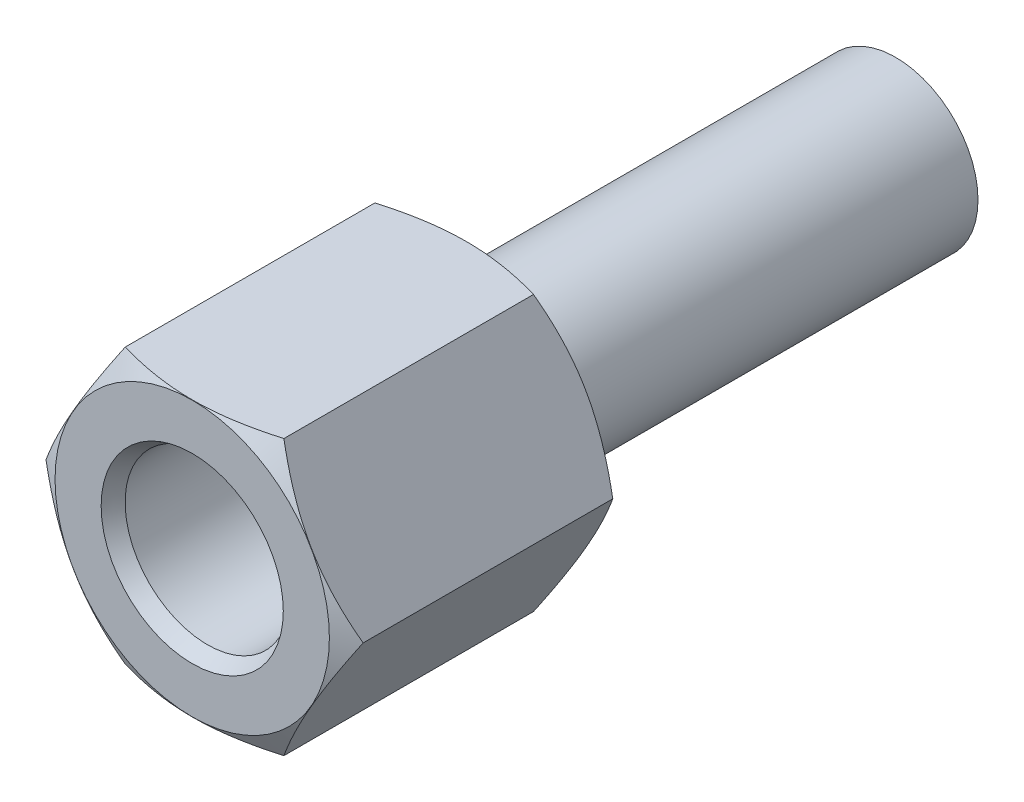
ISO-10303-21;
HEADER;
FILE_DESCRIPTION(('STEP AP214'),'2;1');
FILE_NAME('part.step','',(''),(''),'','','');
FILE_SCHEMA(('AUTOMOTIVE_DESIGN { 1 0 10303 214 1 1 1 1 }'));
ENDSEC;
DATA;
#1=APPLICATION_CONTEXT('core data for automotive mechanical design processes');
#2=APPLICATION_PROTOCOL_DEFINITION('international standard','automotive_design',2000,#1);
#3=PRODUCT_CONTEXT('',#1,'mechanical');
#4=PRODUCT('Part','Part','',(#3));
#5=PRODUCT_RELATED_PRODUCT_CATEGORY('part','',(#4));
#6=PRODUCT_DEFINITION_FORMATION('','',#4);
#7=PRODUCT_DEFINITION_CONTEXT('part definition',#1,'design');
#8=PRODUCT_DEFINITION('design','',#6,#7);
#9=PRODUCT_DEFINITION_SHAPE('','',#8);
#10=(LENGTH_UNIT() NAMED_UNIT(*) SI_UNIT(.MILLI.,.METRE.));
#11=(NAMED_UNIT(*) PLANE_ANGLE_UNIT() SI_UNIT($,.RADIAN.));
#12=(NAMED_UNIT(*) SI_UNIT($,.STERADIAN.) SOLID_ANGLE_UNIT());
#13=UNCERTAINTY_MEASURE_WITH_UNIT(LENGTH_MEASURE(1.E-05),#10,'distance_accuracy_value','');
#14=(GEOMETRIC_REPRESENTATION_CONTEXT(3) GLOBAL_UNCERTAINTY_ASSIGNED_CONTEXT((#13)) GLOBAL_UNIT_ASSIGNED_CONTEXT((#10,
#11,#12)) REPRESENTATION_CONTEXT('',''));
#15=CARTESIAN_POINT('',(0.,0.,0.));
#16=DIRECTION('',(0.,0.,1.));
#17=DIRECTION('',(1.,0.,0.));
#18=AXIS2_PLACEMENT_3D('',#15,#16,#17);
#19=CARTESIAN_POINT('',(0.,0.,2.00000000000955));
#20=DIRECTION('',(0.,0.,1.));
#21=DIRECTION('',(1.,0.,0.));
#22=AXIS2_PLACEMENT_3D('',#19,#20,#21);
#23=CONICAL_SURFACE('',#22,1.50000000002137,1.04719755119044);
#24=CARTESIAN_POINT('',(0.,0.,2.));
#25=DIRECTION('',(0.,0.,-1.));
#26=DIRECTION('',(-1.,0.,0.));
#27=AXIS2_PLACEMENT_3D('',#24,#25,#26);
#28=CIRCLE('',#27,1.5);
#29=CARTESIAN_POINT('',(-1.5,0.,2.));
#30=VERTEX_POINT('',#29);
#31=EDGE_CURVE('E229',#30,#30,#28,.F.);
#32=ORIENTED_EDGE('',*,*,#31,.T.);
#33=EDGE_LOOP('',(#32));
#34=FACE_BOUND('',#33,.T.);
#35=CARTESIAN_POINT('',(0.,0.,1.13397459620046));
#36=VERTEX_POINT('',#35);
#37=VERTEX_LOOP('',#36);
#38=FACE_BOUND('',#37,.T.);
#39=ADVANCED_FACE('F16',(#34,#38),#23,.F.);
#40=CARTESIAN_POINT('',(0.,0.,4.722871870789));
#41=DIRECTION('',(0.,0.,-1.));
#42=DIRECTION('',(-1.,0.,0.));
#43=AXIS2_PLACEMENT_3D('',#40,#41,#42);
#44=CYLINDRICAL_SURFACE('',#43,1.5);
#45=ORIENTED_EDGE('',*,*,#31,.F.);
#46=EDGE_LOOP('',(#45));
#47=FACE_BOUND('',#46,.T.);
#48=CARTESIAN_POINT('',(0.,0.,4.72287187079701));
#49=DIRECTION('',(0.,0.,1.));
#50=DIRECTION('',(1.,0.,0.));
#51=AXIS2_PLACEMENT_3D('',#48,#49,#50);
#52=CIRCLE('',#51,1.49999999996453);
#53=CARTESIAN_POINT('',(1.49999999996453,0.,4.72287187079701));
#54=VERTEX_POINT('',#53);
#55=EDGE_CURVE('E231',#54,#54,#52,.T.);
#56=ORIENTED_EDGE('',*,*,#55,.T.);
#57=EDGE_LOOP('',(#56));
#58=FACE_BOUND('',#57,.T.);
#59=ADVANCED_FACE('F74',(#47,#58),#44,.F.);
#60=CARTESIAN_POINT('',(0.,0.,4.99999999999545));
#61=DIRECTION('',(0.,0.,1.));
#62=DIRECTION('',(1.,0.,0.));
#63=AXIS2_PLACEMENT_3D('',#60,#61,#62);
#64=CONICAL_SURFACE('',#63,1.65999999995847,0.523598775601555);
#65=ORIENTED_EDGE('',*,*,#55,.F.);
#66=EDGE_LOOP('',(#65));
#67=FACE_BOUND('',#66,.T.);
#68=CARTESIAN_POINT('',(0.,0.,4.99999999999545));
#69=DIRECTION('',(0.,0.,1.));
#70=DIRECTION('',(1.,0.,0.));
#71=AXIS2_PLACEMENT_3D('',#68,#69,#70);
#72=CIRCLE('',#71,1.65999999995847);
#73=CARTESIAN_POINT('',(1.65999999995847,0.,4.99999999999545));
#74=VERTEX_POINT('',#73);
#75=EDGE_CURVE('E19',#74,#74,#72,.F.);
#76=ORIENTED_EDGE('',*,*,#75,.F.);
#77=EDGE_LOOP('',(#76));
#78=FACE_BOUND('',#77,.T.);
#79=ADVANCED_FACE('F80',(#67,#78),#64,.F.);
#80=CARTESIAN_POINT('',(0.,0.,5.));
#81=DIRECTION('',(0.,0.,1.));
#82=DIRECTION('',(1.,0.,0.));
#83=AXIS2_PLACEMENT_3D('',#80,#81,#82);
#84=PLANE('',#83);
#85=ORIENTED_EDGE('',*,*,#75,.T.);
#86=EDGE_LOOP('',(#85));
#87=FACE_BOUND('',#86,.T.);
#88=CARTESIAN_POINT('',(0.,0.,4.99999999999545));
#89=DIRECTION('',(0.,0.,-1.));
#90=DIRECTION('',(-1.,0.,0.));
#91=AXIS2_PLACEMENT_3D('',#88,#89,#90);
#92=CIRCLE('',#91,2.49999999999773);
#93=CARTESIAN_POINT('',(-2.49999999999773,0.,4.99999999999545));
#94=VERTEX_POINT('',#93);
#95=EDGE_CURVE('E256',#94,#94,#92,.T.);
#96=ORIENTED_EDGE('',*,*,#95,.F.);
#97=EDGE_LOOP('',(#96));
#98=FACE_BOUND('',#97,.T.);
#99=ADVANCED_FACE('F177',(#87,#98),#84,.T.);
#100=CARTESIAN_POINT('',(0.,0.,4.77348239542152));
#101=DIRECTION('',(0.,0.,-1.));
#102=DIRECTION('',(-1.,0.,0.));
#103=AXIS2_PLACEMENT_3D('',#100,#101,#102);
#104=CONICAL_SURFACE('',#103,2.89233999995986,1.04719755123113);
#105=ORIENTED_EDGE('',*,*,#95,.T.);
#106=EDGE_LOOP('',(#105));
#107=FACE_BOUND('',#106,.T.);
#108=CARTESIAN_POINT('',(-1.44499999999838,2.50281341693981,4.77483339502722));
#109=CARTESIAN_POINT('',(-1.50849899876228,2.39282992485103,4.81150518644063));
#110=CARTESIAN_POINT('',(-1.57254611998008,2.28189705682334,4.84485626147256));
#111=CARTESIAN_POINT('',(-1.70174929547705,2.05811059236346,4.90306956126464));
#112=CARTESIAN_POINT('',(-1.76690764469931,1.94525302097324,4.92791119461376));
#113=CARTESIAN_POINT('',(-1.89641686838524,1.72093646550052,4.96657898788485));
#114=CARTESIAN_POINT('',(-1.96074782177679,1.60951198572708,4.98066253340854));
#115=CARTESIAN_POINT('',(-2.08971226902661,1.38613901072047,4.99747220352045));
#116=CARTESIAN_POINT('',(-2.15434529445582,1.27419132683024,5.00021225130847));
#117=CARTESIAN_POINT('',(-2.2751051688078,1.06502908893707,4.99449745707391));
#118=CARTESIAN_POINT('',(-2.33125013873352,0.967783148436354,4.98744578645263));
#119=CARTESIAN_POINT('',(-2.44317431242009,0.773924793016149,4.96510064886906));
#120=CARTESIAN_POINT('',(-2.49895312935405,0.677313048100495,4.94979955632224));
#121=CARTESIAN_POINT('',(-2.61110787739366,0.483055326185902,4.91154978647978));
#122=CARTESIAN_POINT('',(-2.66746962096312,0.385433922720482,4.88843904655827));
#123=CARTESIAN_POINT('',(-2.77935271582879,0.191646717905188,4.8359874373398));
#124=CARTESIAN_POINT('',(-2.83487549937107,0.0954784358323536,4.8066588841727));
#125=CARTESIAN_POINT('',(-2.89000000000216,-2.49190947932241E-12,4.7748333950269));
#126=B_SPLINE_CURVE_WITH_KNOTS('',3,(#108,#109,#110,#111,#112,#113,#114,#115,#116,#117,#118,
#119,#120,#121,#122,#123,#124,#125),.UNSPECIFIED.,.F.,.F.,(4,2,2,2,2,2,2,2,4),(0.,
0.396715963549139,0.794385241111785,1.18221343586719,1.569565462385,1.90677814091874,
2.24430306723627,2.58931267901555,2.93364518257142),.UNSPECIFIED.);
#127=CARTESIAN_POINT('',(-1.44500000000081,2.5028134169384,4.77483339502722));
#128=VERTEX_POINT('',#127);
#129=CARTESIAN_POINT('',(-2.89000000000194,2.51709403953251E-13,4.77483339502702));
#130=VERTEX_POINT('',#129);
#131=EDGE_CURVE('E163',#128,#130,#126,.T.);
#132=ORIENTED_EDGE('',*,*,#131,.T.);
#133=CARTESIAN_POINT('',(-2.89000000000173,2.99514099448726E-12,4.77483339502715));
#134=CARTESIAN_POINT('',(-2.82650100123783,-0.109983492085782,4.81150518644058));
#135=CARTESIAN_POINT('',(-2.76245388002003,-0.220916360113464,4.84485626147255));
#136=CARTESIAN_POINT('',(-2.63325070452307,-0.444702824573338,4.9030695612647));
#137=CARTESIAN_POINT('',(-2.5680923553008,-0.557560395963558,4.92791119461386));
#138=CARTESIAN_POINT('',(-2.43858313161487,-0.781876951436276,4.96657898788504));
#139=CARTESIAN_POINT('',(-2.37425217822333,-0.893301431209721,4.98066253340876));
#140=CARTESIAN_POINT('',(-2.24528773097351,-1.11667440621633,4.99747220352076));
#141=CARTESIAN_POINT('',(-2.1806547055443,-1.22862209010656,5.00021225130882));
#142=CARTESIAN_POINT('',(-2.0598948311923,-1.43778432799975,4.99449745707434));
#143=CARTESIAN_POINT('',(-2.00374986126657,-1.53503026850049,4.98744578645309));
#144=CARTESIAN_POINT('',(-1.89182568757997,-1.72888862392074,4.96510064886957));
#145=CARTESIAN_POINT('',(-1.836046870646,-1.82550036883642,4.94979955632277));
#146=CARTESIAN_POINT('',(-1.72389212260636,-2.01975809075106,4.91154978648035));
#147=CARTESIAN_POINT('',(-1.66753037903689,-2.1173794942165,4.88843904655885));
#148=CARTESIAN_POINT('',(-1.55564728417119,-2.31116669903184,4.8359874373404));
#149=CARTESIAN_POINT('',(-1.50012450062889,-2.4073349811047,4.8066588841733));
#150=CARTESIAN_POINT('',(-1.4449999999978,-2.50281341693957,4.77483339502751));
#151=B_SPLINE_CURVE_WITH_KNOTS('',3,(#133,#134,#135,#136,#137,#138,#139,#140,#141,#142,#143,
#144,#145,#146,#147,#148,#149,#150),.UNSPECIFIED.,.F.,.F.,(4,2,2,2,2,2,2,2,4),(0.,
0.396715963549155,0.794385241111819,1.18221343586723,1.56956546238505,1.90677814091887,
2.24430306723646,2.58931267901581,2.93364518257176),.UNSPECIFIED.);
#152=CARTESIAN_POINT('',(-1.44500000000037,-2.50281341693828,4.77483339502741));
#153=VERTEX_POINT('',#152);
#154=EDGE_CURVE('E154',#130,#153,#151,.T.);
#155=ORIENTED_EDGE('',*,*,#154,.T.);
#156=CARTESIAN_POINT('',(-1.44500000000294,-2.502813416937,4.77483339502731));
#157=CARTESIAN_POINT('',(-1.31800200247519,-2.502813416937,4.81150518644072));
#158=CARTESIAN_POINT('',(-1.18990776003966,-2.502813416937,4.84485626147266));
#159=CARTESIAN_POINT('',(-0.931501409045835,-2.502813416937,4.90306956126476));
#160=CARTESIAN_POINT('',(-0.801184710601364,-2.502813416937,4.92791119461389));
#161=CARTESIAN_POINT('',(-0.54216626322962,-2.502813416937,4.966578987885));
#162=CARTESIAN_POINT('',(-0.413504356446586,-2.502813416937,4.98066253340869));
#163=CARTESIAN_POINT('',(-0.155575461947063,-2.502813416937,4.99747220352063));
#164=CARTESIAN_POINT('',(-0.0263094110887,-2.502813416937,5.00021225130866));
#165=CARTESIAN_POINT('',(0.215210337615157,-2.502813416937,4.99449745707412));
#166=CARTESIAN_POINT('',(0.327500277466535,-2.502813416937,4.98744578645285));
#167=CARTESIAN_POINT('',(0.551348624839561,-2.502813416937,4.9651006488693));
#168=CARTESIAN_POINT('',(0.662906258707426,-2.502813416937,4.94979955632249));
#169=CARTESIAN_POINT('',(0.887215754786534,-2.502813416937,4.91154978648005));
#170=CARTESIAN_POINT('',(0.999939241925393,-2.502813416937,4.88843904655855));
#171=CARTESIAN_POINT('',(1.22370543165662,-2.502813416937,4.83598743734011));
#172=CARTESIAN_POINT('',(1.33475099874114,-2.502813416937,4.80665888417301));
#173=CARTESIAN_POINT('',(1.44500000000324,-2.502813416937,4.77483339502722));
#174=B_SPLINE_CURVE_WITH_KNOTS('',3,(#156,#157,#158,#159,#160,#161,#162,#163,#164,#165,#166,
#167,#168,#169,#170,#171,#172,#173),.UNSPECIFIED.,.F.,.F.,(4,2,2,2,2,2,2,2,4),(0.,
0.396715963549118,0.794385241111743,1.18221343586712,1.56956546238491,1.90677814091861,
2.24430306723609,2.58931267901532,2.93364518257115),.UNSPECIFIED.);
#175=CARTESIAN_POINT('',(1.44500000000081,-2.5028134169384,4.77483339502722));
#176=VERTEX_POINT('',#175);
#177=EDGE_CURVE('E69',#153,#176,#174,.T.);
#178=ORIENTED_EDGE('',*,*,#177,.T.);
#179=CARTESIAN_POINT('',(1.44499999999838,-2.50281341693981,4.77483339502722));
#180=CARTESIAN_POINT('',(1.50849899876048,-2.39282992485415,4.8115051864396));
#181=CARTESIAN_POINT('',(1.57254611997645,-2.28189705682963,4.84485626147068));
#182=CARTESIAN_POINT('',(1.70174929546948,-2.05811059237657,4.90306956126148));
#183=CARTESIAN_POINT('',(1.76690764468963,-1.94525302099002,4.92791119461021));
#184=CARTESIAN_POINT('',(1.89641686837524,-1.72093646551785,4.96657898788251));
#185=CARTESIAN_POINT('',(1.96074782176863,-1.6095119857412,4.98066253340716));
#186=CARTESIAN_POINT('',(2.08971226902248,-1.38613901072762,4.99747220352023));
#187=CARTESIAN_POINT('',(2.15434529445387,-1.27419132683362,5.00021225130841));
#188=CARTESIAN_POINT('',(2.27510516833894,-1.06502908974917,4.99449745709623));
#189=CARTESIAN_POINT('',(2.33125013779657,-0.967783150059198,4.98744578657074));
#190=CARTESIAN_POINT('',(2.44317431055474,-0.773924796247026,4.96510064931052));
#191=CARTESIAN_POINT('',(2.49895312702841,-0.67731305212862,4.94979955699157));
#192=CARTESIAN_POINT('',(2.61110787413679,-0.483055331826977,4.91154978771731));
#193=CARTESIAN_POINT('',(2.66746961723575,-0.385433929176468,4.88843904814023));
#194=CARTESIAN_POINT('',(2.77935271117757,-0.191646725961345,4.83598743968554));
#195=CARTESIAN_POINT('',(2.83487549426642,-0.0954784446738776,4.80665888693732));
#196=CARTESIAN_POINT('',(2.88999999445043,-9.61338624025139E-09,4.77483339823219));
#197=B_SPLINE_CURVE_WITH_KNOTS('',3,(#179,#180,#181,#182,#183,#184,#185,#186,#187,#188,#189,
#190,#191,#192,#193,#194,#195,#196),.UNSPECIFIED.,.F.,.F.,(4,2,2,2,2,2,2,2,4),(0.,
0.396715963537906,0.794385241087874,1.18221343585471,1.56956546238499,1.90677813810623,
2.24430306160084,2.5893126704106,2.93364517101958),.UNSPECIFIED.);
#198=CARTESIAN_POINT('',(2.88999999722521,-4.80669310484179E-09,4.77483339663017));
#199=VERTEX_POINT('',#198);
#200=EDGE_CURVE('E183',#176,#199,#197,.T.);
#201=ORIENTED_EDGE('',*,*,#200,.T.);
#202=CARTESIAN_POINT('',(2.88999999445001,9.61286279008857E-09,4.77483339823243));
#203=CARTESIAN_POINT('',(2.82650099577799,0.109983501542494,4.81150518938363));
#204=CARTESIAN_POINT('',(2.76245387465266,0.220916369410026,4.84485626413682));
#205=CARTESIAN_POINT('',(2.6332506993496,0.444702833534038,4.90306956334986));
#206=CARTESIAN_POINT('',(2.56809235022884,0.557560404748448,4.92791119639903));
#207=CARTESIAN_POINT('',(2.43858312674574,0.781876959869864,4.96657898907517));
#208=CARTESIAN_POINT('',(2.37425217345515,0.893301439468448,4.98066253430268));
#209=CARTESIAN_POINT('',(2.24528772641906,1.11667441410488,4.99747220384285));
#210=CARTESIAN_POINT('',(2.18065470110259,1.22862209779982,5.00021225135509));
#211=CARTESIAN_POINT('',(2.05989482722202,1.43778433487648,4.99449745666264));
#212=CARTESIAN_POINT('',(2.00374985765308,1.53503027475924,4.98744578589231));
#213=CARTESIAN_POINT('',(1.89182568468122,1.72888862894153,4.96510064812999));
#214=CARTESIAN_POINT('',(1.83604686810518,1.82550037323724,4.94979955555373));
#215=CARTESIAN_POINT('',(1.72389212079416,2.01975809388989,4.91154978576247));
#216=CARTESIAN_POINT('',(1.66753037759509,2.11737949671377,4.88843904592543));
#217=CARTESIAN_POINT('',(1.55564728345879,2.31116670026576,4.83598743696397));
#218=CARTESIAN_POINT('',(1.50012450027552,2.40733498171676,4.80665888396904));
#219=CARTESIAN_POINT('',(1.4449999999978,2.50281341693957,4.77483339502751));
#220=B_SPLINE_CURVE_WITH_KNOTS('',3,(#202,#203,#204,#205,#206,#207,#208,#209,#210,#211,#212,
#213,#214,#215,#216,#217,#218,#219),.UNSPECIFIED.,.F.,.F.,(4,2,2,2,2,2,2,2,4),(0.,
0.396715962800158,0.794385239594449,1.18221343365085,1.5695654594769,1.9067781359095,
2.24430306011777,2.58931266967345,2.93364517101993),.UNSPECIFIED.);
#221=CARTESIAN_POINT('',(1.44500000000037,2.50281341693828,4.77483339502741));
#222=VERTEX_POINT('',#221);
#223=EDGE_CURVE('E190',#199,#222,#220,.T.);
#224=ORIENTED_EDGE('',*,*,#223,.T.);
#225=CARTESIAN_POINT('',(1.44500000000294,2.502813416937,4.77483339502731));
#226=CARTESIAN_POINT('',(1.31800200247519,2.502813416937,4.81150518644072));
#227=CARTESIAN_POINT('',(1.18990776003966,2.502813416937,4.84485626147266));
#228=CARTESIAN_POINT('',(0.931501409045835,2.502813416937,4.90306956126476));
#229=CARTESIAN_POINT('',(0.801184710601364,2.502813416937,4.92791119461389));
#230=CARTESIAN_POINT('',(0.542166263229621,2.502813416937,4.966578987885));
#231=CARTESIAN_POINT('',(0.413504356446587,2.502813416937,4.98066253340869));
#232=CARTESIAN_POINT('',(0.155575461947063,2.502813416937,4.99747220352063));
#233=CARTESIAN_POINT('',(0.0263094110887002,2.502813416937,5.00021225130866));
#234=CARTESIAN_POINT('',(-0.215210337615157,2.502813416937,4.99449745707412));
#235=CARTESIAN_POINT('',(-0.327500277466535,2.502813416937,4.98744578645285));
#236=CARTESIAN_POINT('',(-0.551348624839561,2.502813416937,4.9651006488693));
#237=CARTESIAN_POINT('',(-0.662906258707426,2.502813416937,4.94979955632249));
#238=CARTESIAN_POINT('',(-0.887215754786534,2.502813416937,4.91154978648005));
#239=CARTESIAN_POINT('',(-0.999939241925393,2.502813416937,4.88843904655855));
#240=CARTESIAN_POINT('',(-1.22370543165662,2.502813416937,4.83598743734011));
#241=CARTESIAN_POINT('',(-1.33475099874114,2.502813416937,4.80665888417301));
#242=CARTESIAN_POINT('',(-1.44500000000324,2.502813416937,4.77483339502722));
#243=B_SPLINE_CURVE_WITH_KNOTS('',3,(#225,#226,#227,#228,#229,#230,#231,#232,#233,#234,#235,
#236,#237,#238,#239,#240,#241,#242),.UNSPECIFIED.,.F.,.F.,(4,2,2,2,2,2,2,2,4),(0.,
0.396715963549118,0.794385241111743,1.18221343586712,1.56956546238491,1.90677814091861,
2.2443030672361,2.58931267901532,2.93364518257115),.UNSPECIFIED.);
#244=EDGE_CURVE('E195',#222,#128,#243,.T.);
#245=ORIENTED_EDGE('',*,*,#244,.T.);
#246=EDGE_LOOP('',(#132,#155,#178,#201,#224,#245));
#247=FACE_BOUND('',#246,.T.);
#248=ADVANCED_FACE('F172',(#107,#247),#104,.T.);
#249=CARTESIAN_POINT('',(1.445,-2.502813416937,-10.));
#250=DIRECTION('',(-0.866025403784329,0.50000000000019,0.));
#251=DIRECTION('',(-0.50000000000019,-0.866025403784329,0.));
#252=AXIS2_PLACEMENT_3D('',#249,#250,#251);
#253=PLANE('',#252);
#254=ORIENTED_EDGE('',*,*,#200,.F.);
#255=DIRECTION('',(0.,0.,1.));
#256=VECTOR('',#255,1.);
#257=CARTESIAN_POINT('',(1.445,-2.502813416937,-10.));
#258=LINE('',#257,#256);
#259=CARTESIAN_POINT('',(1.44499995669064,-2.502813416937,0.225166592506377));
#260=VERTEX_POINT('',#259);
#261=EDGE_CURVE('E162',#176,#260,#258,.F.);
#262=ORIENTED_EDGE('',*,*,#261,.T.);
#263=CARTESIAN_POINT('',(2.88999997397761,-1.38019820194764E-08,0.225166608039217));
#264=CARTESIAN_POINT('',(2.82650098441981,-0.109983509985418,0.188494810788673));
#265=CARTESIAN_POINT('',(2.76245386681815,-0.220916379970866,0.155143733601503));
#266=CARTESIAN_POINT('',(2.63325069368864,-0.444702846357763,0.0969304328725599));
#267=CARTESIAN_POINT('',(2.56809234320667,-0.557560417711251,0.0720888007424605));
#268=CARTESIAN_POINT('',(2.43858311844208,-0.781876973474433,0.0334210092116708));
#269=CARTESIAN_POINT('',(2.37425216519928,-0.893301453561608,0.0193374642153052));
#270=CARTESIAN_POINT('',(2.24528771791184,-1.11667442904846,0.0025277954649962));
#271=CARTESIAN_POINT('',(2.1806546922965,-1.22862211310566,-0.000212251485081285));
#272=CARTESIAN_POINT('',(2.05989481776301,-1.43778435121592,0.00550254427152945));
#273=CARTESIAN_POINT('',(2.00374984782553,-1.53503029177009,0.0125542155761748));
#274=CARTESIAN_POINT('',(1.89182567413027,-1.72888864722977,0.0348993544869743));
#275=CARTESIAN_POINT('',(1.83604685719929,-1.82550039213156,0.0502004476758276));
#276=CARTESIAN_POINT('',(1.72389210913152,-2.01975811408781,0.0884502187465144));
#277=CARTESIAN_POINT('',(1.66753036553191,-2.11737951760725,0.111560959259168));
#278=CARTESIAN_POINT('',(1.55564727059629,-2.3111667225473,0.164012569585621));
#279=CARTESIAN_POINT('',(1.50012448701439,-2.40733500469053,0.193341123271452));
#280=CARTESIAN_POINT('',(1.44499998633996,-2.50281344059688,0.225166612895337));
#281=B_SPLINE_CURVE_WITH_KNOTS('',3,(#263,#264,#265,#266,#267,#268,#269,#270,#271,#272,#273,
#274,#275,#276,#277,#278,#279,#280),.UNSPECIFIED.,.F.,.F.,(4,2,2,2,2,2,2,2,4),(0.,
0.396715964821486,0.794385243317122,1.18221343855661,1.56956546569611,1.90677814452655,
2.24430307106758,2.58931268339029,2.93364518758336),.UNSPECIFIED.);
#282=CARTESIAN_POINT('',(2.88999998888216,-2.2657311255068E-13,0.225166598589837));
#283=VERTEX_POINT('',#282);
#284=EDGE_CURVE('E219',#283,#260,#281,.T.);
#285=ORIENTED_EDGE('',*,*,#284,.F.);
#286=DIRECTION('',(0.,0.,1.));
#287=VECTOR('',#286,1.);
#288=CARTESIAN_POINT('',(2.89,0.,-10.));
#289=LINE('',#288,#287);
#290=EDGE_CURVE('E217',#283,#199,#289,.T.);
#291=ORIENTED_EDGE('',*,*,#290,.T.);
#292=EDGE_LOOP('',(#254,#262,#285,#291));
#293=FACE_BOUND('',#292,.T.);
#294=ADVANCED_FACE('F176',(#293),#253,.F.);
#295=CARTESIAN_POINT('',(-1.445,-2.502813416937,-10.));
#296=DIRECTION('',(0.,1.,0.));
#297=DIRECTION('',(-1.,0.,0.));
#298=AXIS2_PLACEMENT_3D('',#295,#296,#297);
#299=PLANE('',#298);
#300=ORIENTED_EDGE('',*,*,#177,.F.);
#301=DIRECTION('',(0.,0.,1.));
#302=VECTOR('',#301,1.);
#303=CARTESIAN_POINT('',(-1.44499999999946,-2.50281341693669,-10.));
#304=LINE('',#303,#302);
#305=CARTESIAN_POINT('',(-1.44499999167559,-2.50281343135406,0.22516660981419));
#306=VERTEX_POINT('',#305);
#307=EDGE_CURVE('E161',#153,#306,#304,.F.);
#308=ORIENTED_EDGE('',*,*,#307,.T.);
#309=CARTESIAN_POINT('',(1.44499991338078,-2.5028134169341,0.225166580005794));
#310=CARTESIAN_POINT('',(1.3180019173133,-2.50281341693596,0.188494790639275));
#311=CARTESIAN_POINT('',(1.18990767634694,-2.50281341693672,0.15514371778307));
#312=CARTESIAN_POINT('',(0.931501328435254,-2.50281341693728,0.0969304225091521));
#313=CARTESIAN_POINT('',(0.801184631604686,-2.50281341693708,0.072088791499621));
#314=CARTESIAN_POINT('',(0.542166187397397,-2.50281341693693,0.0334210028556672));
#315=CARTESIAN_POINT('',(0.413504282158499,-2.50281341693698,0.0193374596335423));
#316=CARTESIAN_POINT('',(0.155575390926183,-2.50281341693702,0.00252779397208133));
#317=CARTESIAN_POINT('',(0.0263093417905344,-2.50281341693701,-0.000212251665168993));
#318=CARTESIAN_POINT('',(-0.215210392271942,-2.502813416937,0.00550254596996531));
#319=CARTESIAN_POINT('',(-0.327500319249851,-2.502813416937,0.0125542170084222));
#320=CARTESIAN_POINT('',(-0.551348640979018,-2.502813416937,0.034899353467775));
#321=CARTESIAN_POINT('',(-0.662906262076903,-2.502813416937,0.050200444468729));
#322=CARTESIAN_POINT('',(-0.887215732251446,-2.502813416937,0.088450209484219));
#323=CARTESIAN_POINT('',(-0.999939206267038,-2.502813416937,0.111560946062535));
#324=CARTESIAN_POINT('',(-1.22370537019648,-2.502813416937,0.164012547323699));
#325=CARTESIAN_POINT('',(-1.33475092460091,-2.502813416937,0.193341095883008));
#326=CARTESIAN_POINT('',(-1.44499991337024,-2.502813416937,0.225166580000854));
#327=B_SPLINE_CURVE_WITH_KNOTS('',3,(#309,#310,#311,#312,#313,#314,#315,#316,#317,#318,#319,
#320,#321,#322,#323,#324,#325,#326),.UNSPECIFIED.,.F.,.F.,(4,2,2,2,2,2,2,2,4),(0.,
0.396715957628351,0.794385229108096,1.18221341850654,1.56956543973195,1.90677807992269,
2.24430296775282,2.58931253901084,2.93364500233251),.UNSPECIFIED.);
#328=EDGE_CURVE('E109',#260,#306,#327,.T.);
#329=ORIENTED_EDGE('',*,*,#328,.F.);
#330=ORIENTED_EDGE('',*,*,#261,.F.);
#331=EDGE_LOOP('',(#300,#308,#329,#330));
#332=FACE_BOUND('',#331,.T.);
#333=ADVANCED_FACE('F147',(#332),#299,.F.);
#334=CARTESIAN_POINT('',(-2.89,0.,-10.));
#335=DIRECTION('',(0.866025403784329,0.50000000000019,0.));
#336=DIRECTION('',(-0.50000000000019,0.866025403784329,0.));
#337=AXIS2_PLACEMENT_3D('',#334,#335,#336);
#338=PLANE('',#337);
#339=ORIENTED_EDGE('',*,*,#154,.F.);
#340=DIRECTION('',(0.,0.,1.));
#341=VECTOR('',#340,1.);
#342=CARTESIAN_POINT('',(-2.89000000000057,2.4980018054066E-13,-10.));
#343=LINE('',#342,#341);
#344=CARTESIAN_POINT('',(-2.89000000832439,-1.44170335978491E-08,0.225166609814816));
#345=VERTEX_POINT('',#344);
#346=EDGE_CURVE('E200',#130,#345,#343,.F.);
#347=ORIENTED_EDGE('',*,*,#346,.T.);
#348=CARTESIAN_POINT('',(-1.44499995414399,-2.50281342135336,0.22516663728491));
#349=CARTESIAN_POINT('',(-1.50849897314539,-2.39282994228028,0.188494829846649));
#350=CARTESIAN_POINT('',(-1.57254610346179,-2.28189707821244,0.15514374748916));
#351=CARTESIAN_POINT('',(-1.70174928725667,-2.05811061383786,0.0969304409618952));
#352=CARTESIAN_POINT('',(-1.76690763565298,-1.94525303855671,0.0720888082068526));
#353=CARTESIAN_POINT('',(-1.89641686022338,-1.72093647776745,0.0334210144585997));
#354=CARTESIAN_POINT('',(-1.96074781525651,-1.60951199652119,0.0193374678778423));
#355=CARTESIAN_POINT('',(-2.08971226517843,-1.38613901788197,0.00252779655654801));
#356=CARTESIAN_POINT('',(-2.15434529163926,-1.27419133183218,-0.000212251376235502));
#357=CARTESIAN_POINT('',(-2.27510516350449,-1.06502909801284,0.00550254262594668));
#358=CARTESIAN_POINT('',(-2.33125012989814,-0.967783163709169,0.012554212408515));
#359=CARTESIAN_POINT('',(-2.44317429651408,-0.77392482059422,0.0348993473443217));
#360=CARTESIAN_POINT('',(-2.49895310990981,-0.677313081786115,0.0502004380754532));
#361=CARTESIAN_POINT('',(-2.61110785092926,-0.483055372013709,0.0884502034694734));
#362=CARTESIAN_POINT('',(-2.66746959101907,-0.385433974579549,0.111560940743669));
#363=CARTESIAN_POINT('',(-2.77935267909441,-0.191646781534076,0.164012544149122));
#364=CARTESIAN_POINT('',(-2.83487545932501,-0.0954785052015375,0.193341094158537));
#365=CARTESIAN_POINT('',(-2.88999995668531,-7.50232349193133E-08,0.22516658000098));
#366=B_SPLINE_CURVE_WITH_KNOTS('',3,(#348,#349,#350,#351,#352,#353,#354,#355,#356,#357,#358,
#359,#360,#361,#362,#363,#364,#365),.UNSPECIFIED.,.F.,.F.,(4,2,2,2,2,2,2,2,4),(0.,
0.396715972277563,0.794385257885561,1.18221345940312,1.5695654929712,1.90677815007945,
2.24430305471649,2.58931264446343,2.93364512641115),.UNSPECIFIED.);
#367=EDGE_CURVE('E137',#306,#345,#366,.T.);
#368=ORIENTED_EDGE('',*,*,#367,.F.);
#369=ORIENTED_EDGE('',*,*,#307,.F.);
#370=EDGE_LOOP('',(#339,#347,#368,#369));
#371=FACE_BOUND('',#370,.T.);
#372=ADVANCED_FACE('F143',(#371),#338,.F.);
#373=CARTESIAN_POINT('',(-1.445,2.502813416937,-10.));
#374=DIRECTION('',(0.866025403784329,-0.50000000000019,0.));
#375=DIRECTION('',(0.50000000000019,0.866025403784329,0.));
#376=AXIS2_PLACEMENT_3D('',#373,#374,#375);
#377=PLANE('',#376);
#378=ORIENTED_EDGE('',*,*,#131,.F.);
#379=DIRECTION('',(0.,0.,1.));
#380=VECTOR('',#379,1.);
#381=CARTESIAN_POINT('',(-1.445,2.502813416937,-10.));
#382=LINE('',#381,#380);
#383=CARTESIAN_POINT('',(-1.44500001664687,2.502813416937,0.225166609814249));
#384=VERTEX_POINT('',#383);
#385=EDGE_CURVE('E199',#128,#384,#382,.F.);
#386=ORIENTED_EDGE('',*,*,#385,.T.);
#387=CARTESIAN_POINT('',(-2.88999998089742,-4.19200165109485E-08,0.225166637285674));
#388=CARTESIAN_POINT('',(-2.82650100352433,0.109983461187212,0.188494829847277));
#389=CARTESIAN_POINT('',(-2.76245389028521,0.220916335114674,0.155143747489716));
#390=CARTESIAN_POINT('',(-2.63325071901106,0.444702806718224,0.096930440962367));
#391=CARTESIAN_POINT('',(-2.56809236600612,0.557560379338656,0.0720888082073119));
#392=CARTESIAN_POINT('',(-2.4385831381581,0.781876938235713,0.0334210144590249));
#393=CARTESIAN_POINT('',(-2.37425218431183,0.893301420167264,0.0193374678782458));
#394=CARTESIAN_POINT('',(-2.24528773525207,1.11667439930439,0.00252779655691825));
#395=CARTESIAN_POINT('',(-2.1806547084684,1.22862208516786,-0.000212251375876739));
#396=CARTESIAN_POINT('',(-2.05989483640102,1.43778431887061,0.00550254262629013));
#397=CARTESIAN_POINT('',(-2.00374987007605,1.53503025321398,0.0125542124088536));
#398=CARTESIAN_POINT('',(-1.89182570351079,1.7288885963583,0.0348993473446564));
#399=CARTESIAN_POINT('',(-1.83604689009698,1.82550033515602,0.0502004380757888));
#400=CARTESIAN_POINT('',(-1.72389214906268,2.01975804491997,0.0884502034698161));
#401=CARTESIAN_POINT('',(-1.6675304089766,2.11737944235634,0.111560940744018));
#402=CARTESIAN_POINT('',(-1.55564732090867,2.31116663540621,0.164012544149489));
#403=CARTESIAN_POINT('',(-1.50012454068176,2.40733491174094,0.193341094158916));
#404=CARTESIAN_POINT('',(-1.44500004331398,2.50281334191498,0.225166580001372));
#405=B_SPLINE_CURVE_WITH_KNOTS('',3,(#387,#388,#389,#390,#391,#392,#393,#394,#395,#396,#397,
#398,#399,#400,#401,#402,#403,#404),.UNSPECIFIED.,.F.,.F.,(4,2,2,2,2,2,2,2,4),(0.,
0.396715972277753,0.794385257885935,1.18221345940367,1.56956549297191,1.90677815008031,
2.24430305471749,2.58931264446458,2.93364512641246),.UNSPECIFIED.);
#406=EDGE_CURVE('E132',#345,#384,#405,.T.);
#407=ORIENTED_EDGE('',*,*,#406,.F.);
#408=ORIENTED_EDGE('',*,*,#346,.F.);
#409=EDGE_LOOP('',(#378,#386,#407,#408));
#410=FACE_BOUND('',#409,.T.);
#411=ADVANCED_FACE('F146',(#410),#377,.F.);
#412=CARTESIAN_POINT('',(1.445,2.502813416937,-10.));
#413=DIRECTION('',(0.,-1.,0.));
#414=DIRECTION('',(1.,0.,0.));
#415=AXIS2_PLACEMENT_3D('',#412,#413,#414);
#416=PLANE('',#415);
#417=ORIENTED_EDGE('',*,*,#244,.F.);
#418=DIRECTION('',(0.,0.,1.));
#419=VECTOR('',#418,1.);
#420=CARTESIAN_POINT('',(1.44499999999946,2.50281341693669,-10.));
#421=LINE('',#420,#419);
#422=CARTESIAN_POINT('',(1.44499999167502,2.50281343135506,0.225166609814522));
#423=VERTEX_POINT('',#422);
#424=EDGE_CURVE('E34',#222,#423,#421,.F.);
#425=ORIENTED_EDGE('',*,*,#424,.T.);
#426=CARTESIAN_POINT('',(-1.44500002675101,2.50281337943371,0.225166637284485));
#427=CARTESIAN_POINT('',(-1.31800203037642,2.5028134034675,0.188494829846408));
#428=CARTESIAN_POINT('',(-1.18990778682092,2.50281341332695,0.155143747489016));
#429=CARTESIAN_POINT('',(-0.931501431752047,2.50281342055573,0.0969304409618657));
#430=CARTESIAN_POINT('',(-0.801184730350934,2.50281341789499,0.072088808206841));
#431=CARTESIAN_POINT('',(-0.542166277932738,2.50281341600272,0.0334210144586412));
#432=CARTESIAN_POINT('',(-0.413504369053434,2.50281341668795,0.0193374678779192));
#433=CARTESIAN_POINT('',(-0.155575470071957,2.50281341718574,0.00252779655668595));
#434=CARTESIAN_POINT('',(-0.0263094168275664,2.50281341699938,-0.000212251376071963));
#435=CARTESIAN_POINT('',(0.215210327104537,2.5028134168827,0.00550254262614589));
#436=CARTESIAN_POINT('',(0.327500259822763,2.50281341692236,0.0125542124087011));
#437=CARTESIAN_POINT('',(0.551348593003187,2.50281341695165,0.0348993473444317));
#438=CARTESIAN_POINT('',(0.66290621981233,2.50281341694122,0.0502004380755003));
#439=CARTESIAN_POINT('',(0.887215701865282,2.50281341693268,0.0884502034693519));
#440=CARTESIAN_POINT('',(0.999939182040768,2.50281341693484,0.11156094074344));
#441=CARTESIAN_POINT('',(1.22370535818324,2.50281341693915,0.164012544148648));
#442=CARTESIAN_POINT('',(1.33475091864035,2.5028134169413,0.193341094157926));
#443=CARTESIAN_POINT('',(1.44499991336805,2.502813416937,0.225166580000222));
#444=B_SPLINE_CURVE_WITH_KNOTS('',3,(#426,#427,#428,#429,#430,#431,#432,#433,#434,#435,#436,
#437,#438,#439,#440,#441,#442,#443),.UNSPECIFIED.,.F.,.F.,(4,2,2,2,2,2,2,2,4),(0.,
0.396715972277448,0.794385257885336,1.18221345940282,1.5695654929708,1.90677815007807,
2.24430305471412,2.58931264446001,2.93364512640669),.UNSPECIFIED.);
#445=EDGE_CURVE('E126',#384,#423,#444,.T.);
#446=ORIENTED_EDGE('',*,*,#445,.F.);
#447=ORIENTED_EDGE('',*,*,#385,.F.);
#448=EDGE_LOOP('',(#417,#425,#446,#447));
#449=FACE_BOUND('',#448,.T.);
#450=ADVANCED_FACE('F201',(#449),#416,.F.);
#451=CARTESIAN_POINT('',(2.89,0.,-10.));
#452=DIRECTION('',(-0.866025403784329,-0.50000000000019,0.));
#453=DIRECTION('',(0.50000000000019,-0.866025403784329,0.));
#454=AXIS2_PLACEMENT_3D('',#451,#452,#453);
#455=PLANE('',#454);
#456=ORIENTED_EDGE('',*,*,#223,.F.);
#457=ORIENTED_EDGE('',*,*,#290,.F.);
#458=CARTESIAN_POINT('',(1.44499995414227,2.50281342135488,0.225166637286011));
#459=CARTESIAN_POINT('',(1.50849897315413,2.39282994226461,0.188494829841668));
#460=CARTESIAN_POINT('',(1.57254610348091,2.28189707817919,0.155143747479226));
#461=CARTESIAN_POINT('',(1.70174928729794,2.05811061376653,0.0969304409446209));
#462=CARTESIAN_POINT('',(1.76690763570604,1.94525303846484,0.07208880818737));
#463=CARTESIAN_POINT('',(1.89641686027827,1.72093647767235,0.0334210144457549));
#464=CARTESIAN_POINT('',(1.96074781530115,1.60951199644386,0.0193374678703062));
#465=CARTESIAN_POINT('',(2.0897122652007,1.3861390178434,0.00252779655535714));
#466=CARTESIAN_POINT('',(2.15434529164941,1.2741913318146,-0.000212251376557218));
#467=CARTESIAN_POINT('',(2.27510516611796,1.06502909348617,0.00550254275032392));
#468=CARTESIAN_POINT('',(2.33125013512145,0.967783154662122,0.0125542130669131));
#469=CARTESIAN_POINT('',(2.44317430691372,0.77392480258153,0.0348993498054984));
#470=CARTESIAN_POINT('',(2.49895312287582,0.677313059328339,0.050200441807129));
#471=CARTESIAN_POINT('',(2.61110786908742,0.483055340562861,0.0884502103690838));
#472=CARTESIAN_POINT('',(2.66746961180045,0.385433938585131,0.111560949563662));
#473=CARTESIAN_POINT('',(2.77935270502681,0.191646736617833,0.164012557227544));
#474=CARTESIAN_POINT('',(2.83487548778555,0.0954784559064406,0.193341109572464));
#475=CARTESIAN_POINT('',(2.88999998763853,2.14106882053934E-08,0.225166597871828));
#476=B_SPLINE_CURVE_WITH_KNOTS('',3,(#458,#459,#460,#461,#462,#463,#464,#465,#466,#467,#468,
#469,#470,#471,#472,#473,#474,#475),.UNSPECIFIED.,.F.,.F.,(4,2,2,2,2,2,2,2,4),(0.,
0.39671597234048,0.794385258019428,1.1822134594735,1.56956549297225,1.90677816576175,
2.24430308613805,2.5893126924416,2.93364519081987),.UNSPECIFIED.);
#477=EDGE_CURVE('E119',#423,#283,#476,.T.);
#478=ORIENTED_EDGE('',*,*,#477,.F.);
#479=ORIENTED_EDGE('',*,*,#424,.F.);
#480=EDGE_LOOP('',(#456,#457,#478,#479));
#481=FACE_BOUND('',#480,.T.);
#482=ADVANCED_FACE('F204',(#481),#455,.F.);
#483=CARTESIAN_POINT('',(0.,0.,-8.));
#484=DIRECTION('',(0.,0.,1.));
#485=DIRECTION('',(1.,0.,0.));
#486=AXIS2_PLACEMENT_3D('',#483,#484,#485);
#487=PLANE('',#486);
#488=CARTESIAN_POINT('',(0.,0.,-7.99999999998136));
#489=DIRECTION('',(0.,0.,1.));
#490=DIRECTION('',(1.,0.,0.));
#491=AXIS2_PLACEMENT_3D('',#488,#489,#490);
#492=CIRCLE('',#491,1.1899999999514);
#493=CARTESIAN_POINT('',(1.1899999999514,0.,-7.99999999998136));
#494=VERTEX_POINT('',#493);
#495=EDGE_CURVE('E236',#494,#494,#492,.T.);
#496=ORIENTED_EDGE('',*,*,#495,.F.);
#497=EDGE_LOOP('',(#496));
#498=FACE_BOUND('',#497,.T.);
#499=ADVANCED_FACE('F103',(#498),#487,.F.);
#500=CARTESIAN_POINT('',(0.,0.,0.226517604517085));
#501=DIRECTION('',(0.,0.,1.));
#502=DIRECTION('',(1.,0.,0.));
#503=AXIS2_PLACEMENT_3D('',#500,#501,#502);
#504=CONICAL_SURFACE('',#503,2.89233999978933,1.0471975511684);
#505=CARTESIAN_POINT('',(0.,0.,8.79369277048681E-12));
#506=DIRECTION('',(0.,0.,1.));
#507=DIRECTION('',(1.,0.,0.));
#508=AXIS2_PLACEMENT_3D('',#505,#506,#507);
#509=CIRCLE('',#508,2.49999999999773);
#510=CARTESIAN_POINT('',(2.49999999999773,0.,8.79369277048681E-12));
#511=VERTEX_POINT('',#510);
#512=EDGE_CURVE('E234',#511,#511,#509,.T.);
#513=ORIENTED_EDGE('',*,*,#512,.T.);
#514=EDGE_LOOP('',(#513));
#515=FACE_BOUND('',#514,.T.);
#516=ORIENTED_EDGE('',*,*,#445,.T.);
#517=ORIENTED_EDGE('',*,*,#477,.T.);
#518=ORIENTED_EDGE('',*,*,#284,.T.);
#519=ORIENTED_EDGE('',*,*,#328,.T.);
#520=ORIENTED_EDGE('',*,*,#367,.T.);
#521=ORIENTED_EDGE('',*,*,#406,.T.);
#522=EDGE_LOOP('',(#516,#517,#518,#519,#520,#521));
#523=FACE_BOUND('',#522,.T.);
#524=ADVANCED_FACE('F98',(#515,#523),#504,.T.);
#525=CARTESIAN_POINT('',(0.,0.,-7.8210214165324));
#526=DIRECTION('',(0.,0.,1.));
#527=DIRECTION('',(1.,0.,0.));
#528=AXIS2_PLACEMENT_3D('',#525,#526,#527);
#529=CONICAL_SURFACE('',#528,1.49999999996453,1.04719755121454);
#530=CARTESIAN_POINT('',(0.,0.,-7.821021416551));
#531=DIRECTION('',(0.,0.,1.));
#532=DIRECTION('',(1.,0.,0.));
#533=AXIS2_PLACEMENT_3D('',#530,#531,#532);
#534=CIRCLE('',#533,1.5);
#535=CARTESIAN_POINT('',(1.5,0.,-7.821021416551));
#536=VERTEX_POINT('',#535);
#537=EDGE_CURVE('E25',#536,#536,#534,.T.);
#538=ORIENTED_EDGE('',*,*,#537,.F.);
#539=EDGE_LOOP('',(#538));
#540=FACE_BOUND('',#539,.T.);
#541=ORIENTED_EDGE('',*,*,#495,.T.);
#542=EDGE_LOOP('',(#541));
#543=FACE_BOUND('',#542,.T.);
#544=ADVANCED_FACE('F91',(#540,#543),#529,.T.);
#545=CARTESIAN_POINT('',(0.,0.,0.));
#546=DIRECTION('',(0.,0.,1.));
#547=DIRECTION('',(1.,0.,0.));
#548=AXIS2_PLACEMENT_3D('',#545,#546,#547);
#549=PLANE('',#548);
#550=ORIENTED_EDGE('',*,*,#512,.F.);
#551=EDGE_LOOP('',(#550));
#552=FACE_BOUND('',#551,.T.);
#553=CARTESIAN_POINT('',(0.,0.,0.));
#554=DIRECTION('',(0.,0.,1.));
#555=DIRECTION('',(1.,0.,0.));
#556=AXIS2_PLACEMENT_3D('',#553,#554,#555);
#557=CIRCLE('',#556,1.5);
#558=CARTESIAN_POINT('',(1.5,0.,0.));
#559=VERTEX_POINT('',#558);
#560=EDGE_CURVE('E10',#559,#559,#557,.F.);
#561=ORIENTED_EDGE('',*,*,#560,.F.);
#562=EDGE_LOOP('',(#561));
#563=FACE_BOUND('',#562,.T.);
#564=ADVANCED_FACE('F85',(#552,#563),#549,.F.);
#565=CARTESIAN_POINT('',(0.,0.,-7.821021416551));
#566=DIRECTION('',(0.,0.,1.));
#567=DIRECTION('',(1.,0.,0.));
#568=AXIS2_PLACEMENT_3D('',#565,#566,#567);
#569=CYLINDRICAL_SURFACE('',#568,1.5);
#570=ORIENTED_EDGE('',*,*,#560,.T.);
#571=EDGE_LOOP('',(#570));
#572=FACE_BOUND('',#571,.T.);
#573=ORIENTED_EDGE('',*,*,#537,.T.);
#574=EDGE_LOOP('',(#573));
#575=FACE_BOUND('',#574,.T.);
#576=ADVANCED_FACE('F83',(#572,#575),#569,.T.);
#577=CLOSED_SHELL('',(#39,#59,#79,#99,#248,#294,#333,#372,#411,#450,#482,#499,#524,#544,#564,#576));
#578=MANIFOLD_SOLID_BREP('B1',#577);
#579=ADVANCED_BREP_SHAPE_REPRESENTATION('',(#18,#578),#14);
#580=SHAPE_DEFINITION_REPRESENTATION(#9,#579);
ENDSEC;
END-ISO-10303-21;
